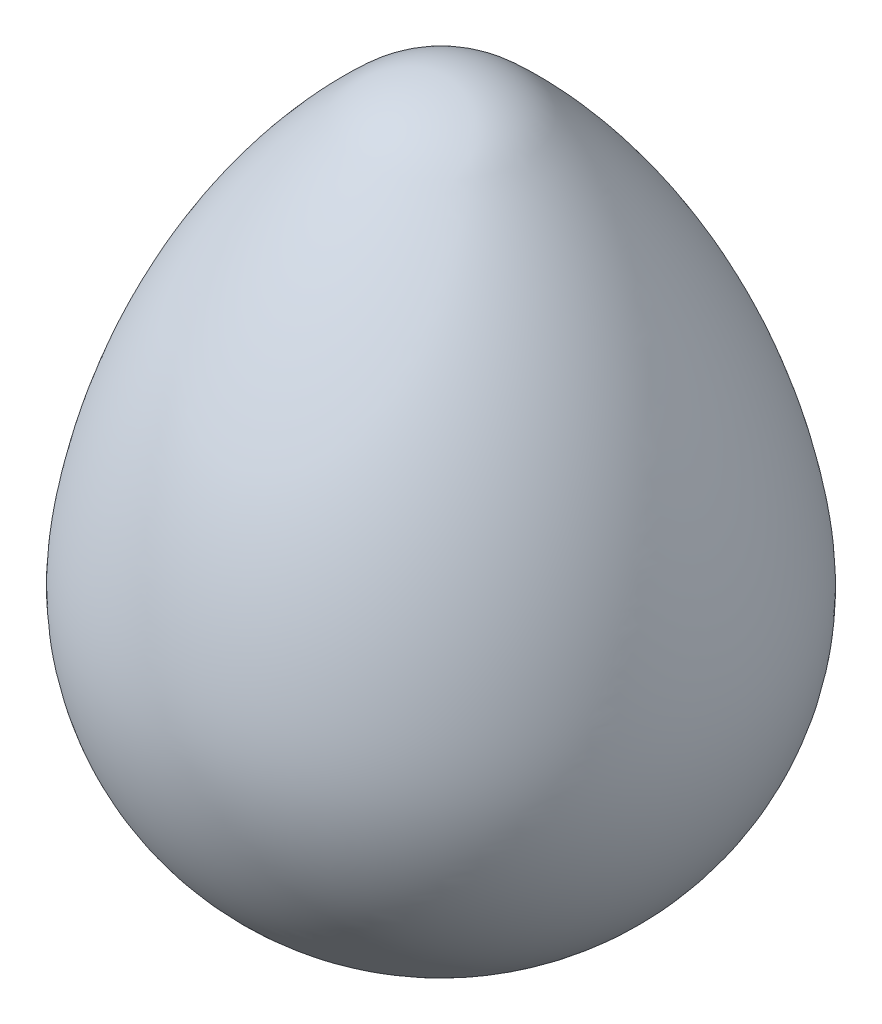
ISO-10303-21;
HEADER;
FILE_DESCRIPTION(('STEP AP214'),'2;1');
FILE_NAME('part.step','',(''),(''),'','','');
FILE_SCHEMA(('AUTOMOTIVE_DESIGN { 1 0 10303 214 1 1 1 1 }'));
ENDSEC;
DATA;
#1=APPLICATION_CONTEXT('core data for automotive mechanical design processes');
#2=APPLICATION_PROTOCOL_DEFINITION('international standard','automotive_design',2000,#1);
#3=PRODUCT_CONTEXT('',#1,'mechanical');
#4=PRODUCT('Part','Part','',(#3));
#5=PRODUCT_RELATED_PRODUCT_CATEGORY('part','',(#4));
#6=PRODUCT_DEFINITION_FORMATION('','',#4);
#7=PRODUCT_DEFINITION_CONTEXT('part definition',#1,'design');
#8=PRODUCT_DEFINITION('design','',#6,#7);
#9=PRODUCT_DEFINITION_SHAPE('','',#8);
#10=(LENGTH_UNIT() NAMED_UNIT(*) SI_UNIT(.MILLI.,.METRE.));
#11=(NAMED_UNIT(*) PLANE_ANGLE_UNIT() SI_UNIT($,.RADIAN.));
#12=(NAMED_UNIT(*) SI_UNIT($,.STERADIAN.) SOLID_ANGLE_UNIT());
#13=UNCERTAINTY_MEASURE_WITH_UNIT(LENGTH_MEASURE(1.E-05),#10,'distance_accuracy_value','');
#14=(GEOMETRIC_REPRESENTATION_CONTEXT(3) GLOBAL_UNCERTAINTY_ASSIGNED_CONTEXT((#13)) GLOBAL_UNIT_ASSIGNED_CONTEXT((#10,
#11,#12)) REPRESENTATION_CONTEXT('',''));
#15=CARTESIAN_POINT('',(0.,0.,0.));
#16=DIRECTION('',(0.,0.,1.));
#17=DIRECTION('',(1.,0.,0.));
#18=AXIS2_PLACEMENT_3D('',#15,#16,#17);
#19=CARTESIAN_POINT('',(0.,-17.5,0.));
#20=CARTESIAN_POINT('',(8.21322784386548,-17.5,0.));
#21=CARTESIAN_POINT('',(14.7373432283348,-12.510708460575,0.));
#22=CARTESIAN_POINT('',(16.8888787537603,-4.5842965044577,0.));
#23=CARTESIAN_POINT('',(17.2943309097566,-3.09058153719648,0.));
#24=CARTESIAN_POINT('',(17.7089061754073,0.00442746685746377,0.));
#25=CARTESIAN_POINT('',(16.9703789310458,4.8415265550779,0.));
#26=CARTESIAN_POINT('',(16.1264646580376,7.82521433614085,0.));
#27=CARTESIAN_POINT('',(15.6196265674324,9.2876407459591,0.));
#28=CARTESIAN_POINT('',(13.6115315771794,15.0817813237974,0.));
#29=CARTESIAN_POINT('',(10.3459517196603,20.2722050752648,0.));
#30=CARTESIAN_POINT('',(5.99185546276366,24.5903477675933,0.));
#31=CARTESIAN_POINT('',(5.77554845265498,24.804868641706,0.));
#32=CARTESIAN_POINT('',(5.33803299617113,25.2289681435023,0.));
#33=CARTESIAN_POINT('',(4.66465794915576,25.8574760377746,0.));
#34=CARTESIAN_POINT('',(4.16859510854456,26.2132632395477,0.));
#35=CARTESIAN_POINT('',(3.91051321756763,26.37513252509,0.));
#36=CARTESIAN_POINT('',(2.73081118998359,27.1150431156203,0.));
#37=CARTESIAN_POINT('',(1.39253888845691,27.5,0.));
#38=CARTESIAN_POINT('',(0.,27.5,0.));
#39=(BOUNDED_CURVE() B_SPLINE_CURVE(3,(#19,#20,#21,#22,#23,#24,#25,#26,#27,#28,#29,#30,#31,#32,
#33,#34,#35,#36,#37,#38),.UNSPECIFIED.,.F.,.F.) B_SPLINE_CURVE_WITH_KNOTS((4,3,1,1,3,3,1,1,3,4),
(0.,0.353875905546685,0.431158938330743,0.508441971114801,0.585725003898859,0.88663967090351,
0.901851160039558,0.917062649175606,0.932274138311654,1.),
.UNSPECIFIED.) CURVE() GEOMETRIC_REPRESENTATION_ITEM() RATIONAL_B_SPLINE_CURVE((1.,
0.862894955024064,0.862894955024064,1.,1.,1.,1.,1.,1.,0.982752581444361,0.982752581444361,1.,1.,
1.,1.,1.,1.,0.974020312883153,0.974020312883153,1.)) REPRESENTATION_ITEM(''));
#40=CARTESIAN_POINT('',(0.,0.,0.));
#41=DIRECTION('',(0.,-1.,0.));
#42=AXIS1_PLACEMENT('',#40,#41);
#43=SURFACE_OF_REVOLUTION('',#39,#42);
#44=CARTESIAN_POINT('',(0.,27.5,0.));
#45=VERTEX_POINT('',#44);
#46=VERTEX_LOOP('',#45);
#47=FACE_BOUND('',#46,.T.);
#48=CARTESIAN_POINT('',(0.,-17.5,0.));
#49=VERTEX_POINT('',#48);
#50=VERTEX_LOOP('',#49);
#51=FACE_BOUND('',#50,.T.);
#52=ADVANCED_FACE('F35',(#47,#51),#43,.F.);
#53=CLOSED_SHELL('',(#52));
#54=MANIFOLD_SOLID_BREP('B2',#53);
#55=ADVANCED_BREP_SHAPE_REPRESENTATION('',(#18,#54),#14);
#56=SHAPE_DEFINITION_REPRESENTATION(#9,#55);
ENDSEC;
END-ISO-10303-21;
